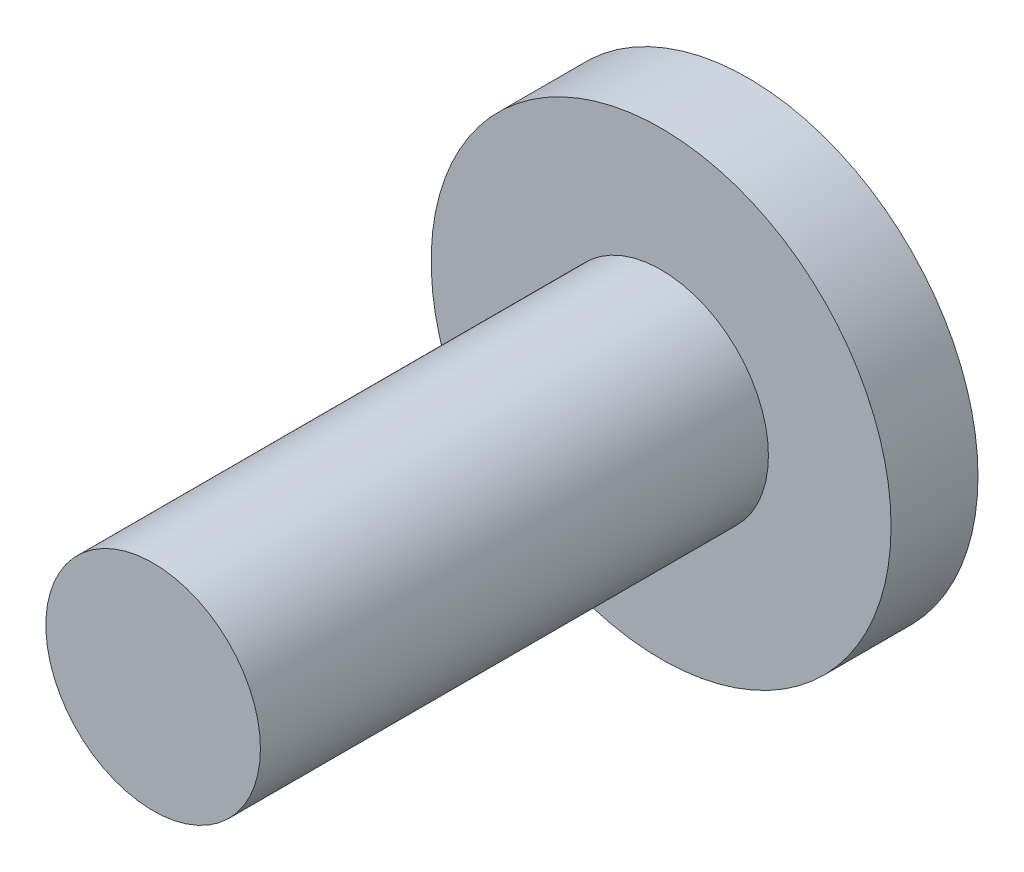
ISO-10303-21;
HEADER;
FILE_DESCRIPTION(('STEP AP214'),'2;1');
FILE_NAME('part.step','',(''),(''),'','','');
FILE_SCHEMA(('AUTOMOTIVE_DESIGN { 1 0 10303 214 1 1 1 1 }'));
ENDSEC;
DATA;
#1=APPLICATION_CONTEXT('core data for automotive mechanical design processes');
#2=APPLICATION_PROTOCOL_DEFINITION('international standard','automotive_design',2000,#1);
#3=PRODUCT_CONTEXT('',#1,'mechanical');
#4=PRODUCT('Part','Part','',(#3));
#5=PRODUCT_RELATED_PRODUCT_CATEGORY('part','',(#4));
#6=PRODUCT_DEFINITION_FORMATION('','',#4);
#7=PRODUCT_DEFINITION_CONTEXT('part definition',#1,'design');
#8=PRODUCT_DEFINITION('design','',#6,#7);
#9=PRODUCT_DEFINITION_SHAPE('','',#8);
#10=(LENGTH_UNIT() NAMED_UNIT(*) SI_UNIT(.MILLI.,.METRE.));
#11=(NAMED_UNIT(*) PLANE_ANGLE_UNIT() SI_UNIT($,.RADIAN.));
#12=(NAMED_UNIT(*) SI_UNIT($,.STERADIAN.) SOLID_ANGLE_UNIT());
#13=UNCERTAINTY_MEASURE_WITH_UNIT(LENGTH_MEASURE(1.E-05),#10,'distance_accuracy_value','');
#14=(GEOMETRIC_REPRESENTATION_CONTEXT(3) GLOBAL_UNCERTAINTY_ASSIGNED_CONTEXT((#13)) GLOBAL_UNIT_ASSIGNED_CONTEXT((#10,
#11,#12)) REPRESENTATION_CONTEXT('',''));
#15=CARTESIAN_POINT('',(0.,0.,0.));
#16=DIRECTION('',(0.,0.,1.));
#17=DIRECTION('',(1.,0.,0.));
#18=AXIS2_PLACEMENT_3D('',#15,#16,#17);
#19=CARTESIAN_POINT('',(0.,0.,3.2));
#20=DIRECTION('',(0.,0.,-1.));
#21=DIRECTION('',(-1.,0.,0.));
#22=AXIS2_PLACEMENT_3D('',#19,#20,#21);
#23=CYLINDRICAL_SURFACE('',#22,8.465);
#24=CARTESIAN_POINT('',(0.,0.,3.2));
#25=DIRECTION('',(0.,0.,1.));
#26=DIRECTION('',(1.,0.,0.));
#27=AXIS2_PLACEMENT_3D('',#24,#25,#26);
#28=CIRCLE('',#27,8.465);
#29=CARTESIAN_POINT('',(8.465,0.,3.2));
#30=VERTEX_POINT('',#29);
#31=EDGE_CURVE('E44',#30,#30,#28,.T.);
#32=ORIENTED_EDGE('',*,*,#31,.F.);
#33=EDGE_LOOP('',(#32));
#34=FACE_BOUND('',#33,.T.);
#35=CARTESIAN_POINT('',(0.,0.,0.));
#36=DIRECTION('',(0.,0.,1.));
#37=DIRECTION('',(1.,0.,0.));
#38=AXIS2_PLACEMENT_3D('',#35,#36,#37);
#39=CIRCLE('',#38,8.465);
#40=CARTESIAN_POINT('',(8.465,0.,0.));
#41=VERTEX_POINT('',#40);
#42=EDGE_CURVE('E40',#41,#41,#39,.T.);
#43=ORIENTED_EDGE('',*,*,#42,.T.);
#44=EDGE_LOOP('',(#43));
#45=FACE_BOUND('',#44,.T.);
#46=ADVANCED_FACE('F37',(#34,#45),#23,.T.);
#47=CARTESIAN_POINT('',(0.,0.,3.2));
#48=DIRECTION('',(0.,0.,1.));
#49=DIRECTION('',(1.,0.,0.));
#50=AXIS2_PLACEMENT_3D('',#47,#48,#49);
#51=PLANE('',#50);
#52=CARTESIAN_POINT('',(0.,0.,3.2));
#53=DIRECTION('',(0.,0.,1.));
#54=DIRECTION('',(1.,0.,0.));
#55=AXIS2_PLACEMENT_3D('',#52,#53,#54);
#56=CIRCLE('',#55,3.95);
#57=CARTESIAN_POINT('',(3.95,0.,3.2));
#58=VERTEX_POINT('',#57);
#59=EDGE_CURVE('E10',#58,#58,#56,.T.);
#60=ORIENTED_EDGE('',*,*,#59,.F.);
#61=EDGE_LOOP('',(#60));
#62=FACE_BOUND('',#61,.T.);
#63=ORIENTED_EDGE('',*,*,#31,.T.);
#64=EDGE_LOOP('',(#63));
#65=FACE_BOUND('',#64,.T.);
#66=ADVANCED_FACE('F61',(#62,#65),#51,.T.);
#67=CARTESIAN_POINT('',(0.,0.,0.));
#68=DIRECTION('',(0.,0.,1.));
#69=DIRECTION('',(1.,0.,0.));
#70=AXIS2_PLACEMENT_3D('',#67,#68,#69);
#71=PLANE('',#70);
#72=ORIENTED_EDGE('',*,*,#42,.F.);
#73=EDGE_LOOP('',(#72));
#74=FACE_BOUND('',#73,.T.);
#75=ADVANCED_FACE('F58',(#74),#71,.F.);
#76=CARTESIAN_POINT('',(0.,0.,21.9));
#77=DIRECTION('',(0.,0.,-1.));
#78=DIRECTION('',(-1.,0.,0.));
#79=AXIS2_PLACEMENT_3D('',#76,#77,#78);
#80=CYLINDRICAL_SURFACE('',#79,3.95);
#81=CARTESIAN_POINT('',(0.,0.,21.9));
#82=DIRECTION('',(0.,0.,1.));
#83=DIRECTION('',(1.,0.,0.));
#84=AXIS2_PLACEMENT_3D('',#81,#82,#83);
#85=CIRCLE('',#84,3.95);
#86=CARTESIAN_POINT('',(3.95,0.,21.9));
#87=VERTEX_POINT('',#86);
#88=EDGE_CURVE('E50',#87,#87,#85,.T.);
#89=ORIENTED_EDGE('',*,*,#88,.F.);
#90=EDGE_LOOP('',(#89));
#91=FACE_BOUND('',#90,.T.);
#92=ORIENTED_EDGE('',*,*,#59,.T.);
#93=EDGE_LOOP('',(#92));
#94=FACE_BOUND('',#93,.T.);
#95=ADVANCED_FACE('F60',(#91,#94),#80,.T.);
#96=CARTESIAN_POINT('',(0.,0.,21.9));
#97=DIRECTION('',(0.,0.,1.));
#98=DIRECTION('',(1.,0.,0.));
#99=AXIS2_PLACEMENT_3D('',#96,#97,#98);
#100=PLANE('',#99);
#101=ORIENTED_EDGE('',*,*,#88,.T.);
#102=EDGE_LOOP('',(#101));
#103=FACE_BOUND('',#102,.T.);
#104=ADVANCED_FACE('F67',(#103),#100,.T.);
#105=CLOSED_SHELL('',(#46,#66,#75,#95,#104));
#106=MANIFOLD_SOLID_BREP('B2',#105);
#107=ADVANCED_BREP_SHAPE_REPRESENTATION('',(#18,#106),#14);
#108=SHAPE_DEFINITION_REPRESENTATION(#9,#107);
ENDSEC;
END-ISO-10303-21;
